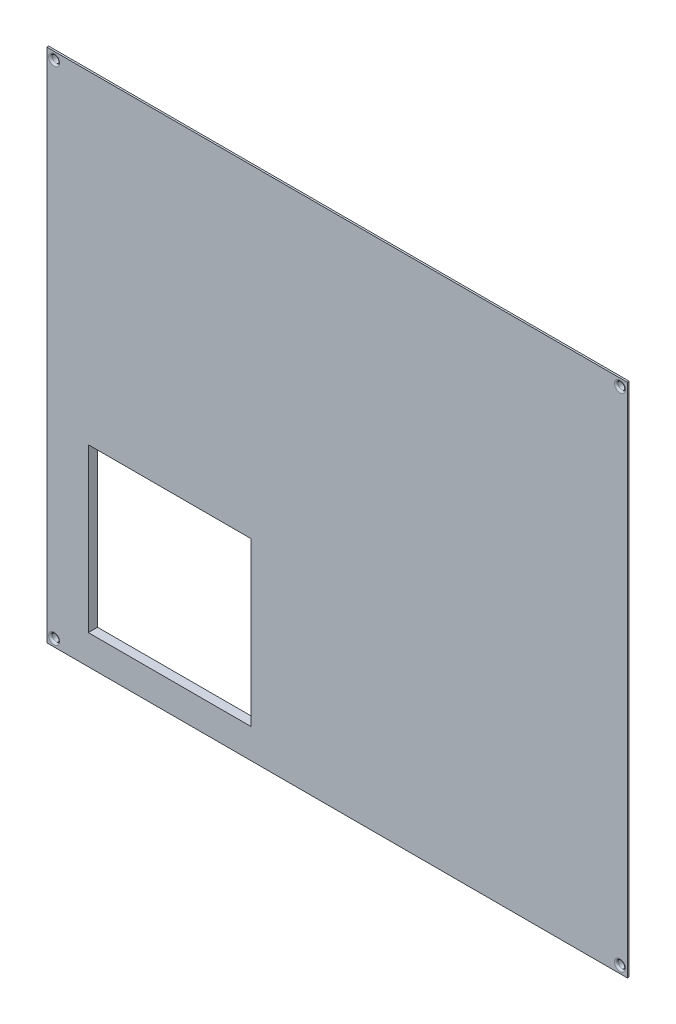
ISO-10303-21;
HEADER;
FILE_DESCRIPTION(('STEP AP214'),'2;1');
FILE_NAME('part.step','',(''),(''),'','','');
FILE_SCHEMA(('AUTOMOTIVE_DESIGN { 1 0 10303 214 1 1 1 1 }'));
ENDSEC;
DATA;
#1=APPLICATION_CONTEXT('core data for automotive mechanical design processes');
#2=APPLICATION_PROTOCOL_DEFINITION('international standard','automotive_design',2000,#1);
#3=PRODUCT_CONTEXT('',#1,'mechanical');
#4=PRODUCT('Part','Part','',(#3));
#5=PRODUCT_RELATED_PRODUCT_CATEGORY('part','',(#4));
#6=PRODUCT_DEFINITION_FORMATION('','',#4);
#7=PRODUCT_DEFINITION_CONTEXT('part definition',#1,'design');
#8=PRODUCT_DEFINITION('design','',#6,#7);
#9=PRODUCT_DEFINITION_SHAPE('','',#8);
#10=(LENGTH_UNIT() NAMED_UNIT(*) SI_UNIT(.MILLI.,.METRE.));
#11=(NAMED_UNIT(*) PLANE_ANGLE_UNIT() SI_UNIT($,.RADIAN.));
#12=(NAMED_UNIT(*) SI_UNIT($,.STERADIAN.) SOLID_ANGLE_UNIT());
#13=UNCERTAINTY_MEASURE_WITH_UNIT(LENGTH_MEASURE(1.E-05),#10,'distance_accuracy_value','');
#14=(GEOMETRIC_REPRESENTATION_CONTEXT(3) GLOBAL_UNCERTAINTY_ASSIGNED_CONTEXT((#13)) GLOBAL_UNIT_ASSIGNED_CONTEXT((#10,
#11,#12)) REPRESENTATION_CONTEXT('',''));
#15=CARTESIAN_POINT('',(0.,0.,0.));
#16=DIRECTION('',(0.,0.,1.));
#17=DIRECTION('',(1.,0.,0.));
#18=AXIS2_PLACEMENT_3D('',#15,#16,#17);
#19=CARTESIAN_POINT('',(0.,0.,2.5));
#20=DIRECTION('',(1.,0.,0.));
#21=DIRECTION('',(0.,1.,0.));
#22=AXIS2_PLACEMENT_3D('',#19,#20,#21);
#23=PLANE('',#22);
#24=DIRECTION('',(0.,0.,-1.));
#25=VECTOR('',#24,1.);
#26=CARTESIAN_POINT('',(0.,139.5,2.5));
#27=LINE('',#26,#25);
#28=CARTESIAN_POINT('',(0.,139.5,2.5));
#29=VERTEX_POINT('',#28);
#30=CARTESIAN_POINT('',(0.,139.5,1.99999999999997));
#31=VERTEX_POINT('',#30);
#32=EDGE_CURVE('E286',#29,#31,#27,.T.);
#33=ORIENTED_EDGE('',*,*,#32,.T.);
#34=DIRECTION('',(0.,-1.,0.));
#35=VECTOR('',#34,1.);
#36=CARTESIAN_POINT('',(0.,0.,1.99999999999997));
#37=LINE('',#36,#35);
#38=CARTESIAN_POINT('',(0.,0.,1.99999999999997));
#39=VERTEX_POINT('',#38);
#40=EDGE_CURVE('E144',#31,#39,#37,.T.);
#41=ORIENTED_EDGE('',*,*,#40,.T.);
#42=DIRECTION('',(0.,0.,-1.));
#43=VECTOR('',#42,1.);
#44=CARTESIAN_POINT('',(0.,0.,2.5));
#45=LINE('',#44,#43);
#46=CARTESIAN_POINT('',(0.,0.,2.5));
#47=VERTEX_POINT('',#46);
#48=EDGE_CURVE('E284',#47,#39,#45,.T.);
#49=ORIENTED_EDGE('',*,*,#48,.F.);
#50=DIRECTION('',(0.,-1.,0.));
#51=VECTOR('',#50,1.);
#52=CARTESIAN_POINT('',(0.,0.,2.5));
#53=LINE('',#52,#51);
#54=EDGE_CURVE('E170',#29,#47,#53,.T.);
#55=ORIENTED_EDGE('',*,*,#54,.F.);
#56=EDGE_LOOP('',(#33,#41,#49,#55));
#57=FACE_BOUND('',#56,.T.);
#58=ADVANCED_FACE('F33',(#57),#23,.F.);
#59=CARTESIAN_POINT('',(0.,0.,2.5));
#60=DIRECTION('',(0.,1.,0.));
#61=DIRECTION('',(0.,0.,1.));
#62=AXIS2_PLACEMENT_3D('',#59,#60,#61);
#63=PLANE('',#62);
#64=ORIENTED_EDGE('',*,*,#48,.T.);
#65=DIRECTION('',(1.,0.,0.));
#66=VECTOR('',#65,1.);
#67=CARTESIAN_POINT('',(157.,0.,1.99999999999997));
#68=LINE('',#67,#66);
#69=CARTESIAN_POINT('',(157.,0.,1.99999999999997));
#70=VERTEX_POINT('',#69);
#71=EDGE_CURVE('E159',#39,#70,#68,.T.);
#72=ORIENTED_EDGE('',*,*,#71,.T.);
#73=DIRECTION('',(0.,0.,-1.));
#74=VECTOR('',#73,1.);
#75=CARTESIAN_POINT('',(157.,0.,2.5));
#76=LINE('',#75,#74);
#77=CARTESIAN_POINT('',(157.,0.,2.5));
#78=VERTEX_POINT('',#77);
#79=EDGE_CURVE('E292',#78,#70,#76,.T.);
#80=ORIENTED_EDGE('',*,*,#79,.F.);
#81=DIRECTION('',(1.,0.,0.));
#82=VECTOR('',#81,1.);
#83=CARTESIAN_POINT('',(0.,0.,2.5));
#84=LINE('',#83,#82);
#85=EDGE_CURVE('E290',#47,#78,#84,.T.);
#86=ORIENTED_EDGE('',*,*,#85,.F.);
#87=EDGE_LOOP('',(#64,#72,#80,#86));
#88=FACE_BOUND('',#87,.T.);
#89=ADVANCED_FACE('F213',(#88),#63,.F.);
#90=CARTESIAN_POINT('',(157.,0.,2.5));
#91=DIRECTION('',(-1.,0.,0.));
#92=DIRECTION('',(0.,-1.,0.));
#93=AXIS2_PLACEMENT_3D('',#90,#91,#92);
#94=PLANE('',#93);
#95=ORIENTED_EDGE('',*,*,#79,.T.);
#96=DIRECTION('',(0.,1.,0.));
#97=VECTOR('',#96,1.);
#98=CARTESIAN_POINT('',(157.,139.5,1.99999999999997));
#99=LINE('',#98,#97);
#100=CARTESIAN_POINT('',(157.,139.5,1.99999999999997));
#101=VERTEX_POINT('',#100);
#102=EDGE_CURVE('E273',#70,#101,#99,.T.);
#103=ORIENTED_EDGE('',*,*,#102,.T.);
#104=DIRECTION('',(0.,0.,-1.));
#105=VECTOR('',#104,1.);
#106=CARTESIAN_POINT('',(157.,139.5,2.5));
#107=LINE('',#106,#105);
#108=CARTESIAN_POINT('',(157.,139.5,2.5));
#109=VERTEX_POINT('',#108);
#110=EDGE_CURVE('E295',#109,#101,#107,.T.);
#111=ORIENTED_EDGE('',*,*,#110,.F.);
#112=DIRECTION('',(0.,1.,0.));
#113=VECTOR('',#112,1.);
#114=CARTESIAN_POINT('',(157.,0.,2.5));
#115=LINE('',#114,#113);
#116=EDGE_CURVE('E339',#78,#109,#115,.T.);
#117=ORIENTED_EDGE('',*,*,#116,.F.);
#118=EDGE_LOOP('',(#95,#103,#111,#117));
#119=FACE_BOUND('',#118,.T.);
#120=ADVANCED_FACE('F219',(#119),#94,.F.);
#121=CARTESIAN_POINT('',(0.,139.5,2.5));
#122=DIRECTION('',(0.,-1.,0.));
#123=DIRECTION('',(0.,0.,-1.));
#124=AXIS2_PLACEMENT_3D('',#121,#122,#123);
#125=PLANE('',#124);
#126=ORIENTED_EDGE('',*,*,#110,.T.);
#127=DIRECTION('',(-1.,0.,0.));
#128=VECTOR('',#127,1.);
#129=CARTESIAN_POINT('',(0.,139.5,1.99999999999997));
#130=LINE('',#129,#128);
#131=EDGE_CURVE('E280',#101,#31,#130,.T.);
#132=ORIENTED_EDGE('',*,*,#131,.T.);
#133=ORIENTED_EDGE('',*,*,#32,.F.);
#134=DIRECTION('',(-1.,0.,0.));
#135=VECTOR('',#134,1.);
#136=CARTESIAN_POINT('',(0.,139.5,2.5));
#137=LINE('',#136,#135);
#138=EDGE_CURVE('E341',#109,#29,#137,.T.);
#139=ORIENTED_EDGE('',*,*,#138,.F.);
#140=EDGE_LOOP('',(#126,#132,#133,#139));
#141=FACE_BOUND('',#140,.T.);
#142=ADVANCED_FACE('F348',(#141),#125,.F.);
#143=CARTESIAN_POINT('',(0.,0.,2.5));
#144=DIRECTION('',(0.,0.,-1.));
#145=DIRECTION('',(-1.,0.,0.));
#146=AXIS2_PLACEMENT_3D('',#143,#144,#145);
#147=PLANE('',#146);
#148=CARTESIAN_POINT('',(155.,2.,2.5));
#149=DIRECTION('',(0.,0.,-1.));
#150=DIRECTION('',(-1.,0.,0.));
#151=AXIS2_PLACEMENT_3D('',#148,#149,#150);
#152=CIRCLE('',#151,1.5);
#153=CARTESIAN_POINT('',(153.5,2.,2.5));
#154=VERTEX_POINT('',#153);
#155=EDGE_CURVE('E189',#154,#154,#152,.T.);
#156=ORIENTED_EDGE('',*,*,#155,.T.);
#157=EDGE_LOOP('',(#156));
#158=FACE_BOUND('',#157,.T.);
#159=CARTESIAN_POINT('',(1.99999999999997,2.,2.5));
#160=DIRECTION('',(0.,0.,-1.));
#161=DIRECTION('',(-1.,0.,0.));
#162=AXIS2_PLACEMENT_3D('',#159,#160,#161);
#163=CIRCLE('',#162,1.5);
#164=CARTESIAN_POINT('',(0.499999999999974,2.,2.5));
#165=VERTEX_POINT('',#164);
#166=EDGE_CURVE('E186',#165,#165,#163,.T.);
#167=ORIENTED_EDGE('',*,*,#166,.T.);
#168=EDGE_LOOP('',(#167));
#169=FACE_BOUND('',#168,.T.);
#170=CARTESIAN_POINT('',(1.99999999999997,137.5,2.5));
#171=DIRECTION('',(0.,0.,-1.));
#172=DIRECTION('',(-1.,0.,0.));
#173=AXIS2_PLACEMENT_3D('',#170,#171,#172);
#174=CIRCLE('',#173,1.5);
#175=CARTESIAN_POINT('',(0.499999999999974,137.5,2.5));
#176=VERTEX_POINT('',#175);
#177=EDGE_CURVE('E183',#176,#176,#174,.T.);
#178=ORIENTED_EDGE('',*,*,#177,.T.);
#179=EDGE_LOOP('',(#178));
#180=FACE_BOUND('',#179,.T.);
#181=CARTESIAN_POINT('',(155.,137.5,2.5));
#182=DIRECTION('',(0.,0.,-1.));
#183=DIRECTION('',(-1.,0.,0.));
#184=AXIS2_PLACEMENT_3D('',#181,#182,#183);
#185=CIRCLE('',#184,1.5);
#186=CARTESIAN_POINT('',(153.5,137.5,2.5));
#187=VERTEX_POINT('',#186);
#188=EDGE_CURVE('E180',#187,#187,#185,.T.);
#189=ORIENTED_EDGE('',*,*,#188,.T.);
#190=EDGE_LOOP('',(#189));
#191=FACE_BOUND('',#190,.T.);
#192=DIRECTION('',(-1.,0.,0.));
#193=VECTOR('',#192,1.);
#194=CARTESIAN_POINT('',(0.,7.99999999999998,2.5));
#195=LINE('',#194,#193);
#196=CARTESIAN_POINT('',(55.2239720785397,7.99999999999999,2.5));
#197=VERTEX_POINT('',#196);
#198=CARTESIAN_POINT('',(11.2239720785396,7.99999999999999,2.5));
#199=VERTEX_POINT('',#198);
#200=EDGE_CURVE('E332',#197,#199,#195,.T.);
#201=ORIENTED_EDGE('',*,*,#200,.T.);
#202=DIRECTION('',(0.,1.,0.));
#203=VECTOR('',#202,1.);
#204=CARTESIAN_POINT('',(11.2239720785396,0.,2.5));
#205=LINE('',#204,#203);
#206=CARTESIAN_POINT('',(11.2239720785397,52.,2.5));
#207=VERTEX_POINT('',#206);
#208=EDGE_CURVE('E165',#199,#207,#205,.T.);
#209=ORIENTED_EDGE('',*,*,#208,.T.);
#210=DIRECTION('',(1.,0.,0.));
#211=VECTOR('',#210,1.);
#212=CARTESIAN_POINT('',(0.,52.,2.5));
#213=LINE('',#212,#211);
#214=CARTESIAN_POINT('',(55.2239720785397,52.,2.5));
#215=VERTEX_POINT('',#214);
#216=EDGE_CURVE('E320',#207,#215,#213,.T.);
#217=ORIENTED_EDGE('',*,*,#216,.T.);
#218=DIRECTION('',(0.,-1.,0.));
#219=VECTOR('',#218,1.);
#220=CARTESIAN_POINT('',(55.2239720785397,0.,2.5));
#221=LINE('',#220,#219);
#222=EDGE_CURVE('E329',#215,#197,#221,.T.);
#223=ORIENTED_EDGE('',*,*,#222,.T.);
#224=EDGE_LOOP('',(#201,#209,#217,#223));
#225=FACE_BOUND('',#224,.T.);
#226=ORIENTED_EDGE('',*,*,#54,.T.);
#227=ORIENTED_EDGE('',*,*,#85,.T.);
#228=ORIENTED_EDGE('',*,*,#116,.T.);
#229=ORIENTED_EDGE('',*,*,#138,.T.);
#230=EDGE_LOOP('',(#226,#227,#228,#229));
#231=FACE_BOUND('',#230,.T.);
#232=ADVANCED_FACE('F354',(#158,#169,#180,#191,#225,#231),#147,.F.);
#233=CARTESIAN_POINT('',(0.,0.,0.));
#234=DIRECTION('',(0.,0.,-1.));
#235=DIRECTION('',(-1.,0.,0.));
#236=AXIS2_PLACEMENT_3D('',#233,#234,#235);
#237=PLANE('',#236);
#238=CARTESIAN_POINT('',(155.,2.,0.));
#239=DIRECTION('',(0.,0.,-1.));
#240=DIRECTION('',(-1.,0.,0.));
#241=AXIS2_PLACEMENT_3D('',#238,#239,#240);
#242=CIRCLE('',#241,0.999999999999998);
#243=CARTESIAN_POINT('',(154.,1.99999999999997,0.));
#244=VERTEX_POINT('',#243);
#245=CARTESIAN_POINT('',(155.,3.,0.));
#246=VERTEX_POINT('',#245);
#247=EDGE_CURVE('E255',#244,#246,#242,.T.);
#248=ORIENTED_EDGE('',*,*,#247,.F.);
#249=DIRECTION('',(-1.,0.,0.));
#250=VECTOR('',#249,1.);
#251=CARTESIAN_POINT('',(0.,1.99999999999997,0.));
#252=LINE('',#251,#250);
#253=CARTESIAN_POINT('',(2.99999999999997,1.99999999999997,0.));
#254=VERTEX_POINT('',#253);
#255=EDGE_CURVE('E270',#244,#254,#252,.T.);
#256=ORIENTED_EDGE('',*,*,#255,.T.);
#257=CARTESIAN_POINT('',(1.99999999999997,2.,0.));
#258=DIRECTION('',(0.,0.,-1.));
#259=DIRECTION('',(-1.,0.,0.));
#260=AXIS2_PLACEMENT_3D('',#257,#258,#259);
#261=CIRCLE('',#260,0.999999999999998);
#262=CARTESIAN_POINT('',(1.99999999999997,3.00000000000003,0.));
#263=VERTEX_POINT('',#262);
#264=EDGE_CURVE('E138',#263,#254,#261,.T.);
#265=ORIENTED_EDGE('',*,*,#264,.F.);
#266=DIRECTION('',(0.,1.,0.));
#267=VECTOR('',#266,1.);
#268=CARTESIAN_POINT('',(1.99999999999995,139.5,0.));
#269=LINE('',#268,#267);
#270=CARTESIAN_POINT('',(1.99999999999995,136.5,0.));
#271=VERTEX_POINT('',#270);
#272=EDGE_CURVE('E154',#263,#271,#269,.T.);
#273=ORIENTED_EDGE('',*,*,#272,.T.);
#274=CARTESIAN_POINT('',(1.99999999999997,137.5,0.));
#275=DIRECTION('',(0.,0.,-1.));
#276=DIRECTION('',(-1.,0.,0.));
#277=AXIS2_PLACEMENT_3D('',#274,#275,#276);
#278=CIRCLE('',#277,0.999999999999998);
#279=CARTESIAN_POINT('',(3.,137.5,0.));
#280=VERTEX_POINT('',#279);
#281=EDGE_CURVE('E48',#280,#271,#278,.T.);
#282=ORIENTED_EDGE('',*,*,#281,.F.);
#283=DIRECTION('',(1.,0.,0.));
#284=VECTOR('',#283,1.);
#285=CARTESIAN_POINT('',(157.,137.5,0.));
#286=LINE('',#285,#284);
#287=CARTESIAN_POINT('',(154.,137.5,0.));
#288=VERTEX_POINT('',#287);
#289=EDGE_CURVE('E271',#280,#288,#286,.T.);
#290=ORIENTED_EDGE('',*,*,#289,.T.);
#291=CARTESIAN_POINT('',(155.,137.5,0.));
#292=DIRECTION('',(0.,0.,-1.));
#293=DIRECTION('',(-1.,0.,0.));
#294=AXIS2_PLACEMENT_3D('',#291,#292,#293);
#295=CIRCLE('',#294,0.999999999999998);
#296=CARTESIAN_POINT('',(155.,136.5,0.));
#297=VERTEX_POINT('',#296);
#298=EDGE_CURVE('E269',#297,#288,#295,.T.);
#299=ORIENTED_EDGE('',*,*,#298,.F.);
#300=DIRECTION('',(0.,-1.,0.));
#301=VECTOR('',#300,1.);
#302=CARTESIAN_POINT('',(155.,0.,0.));
#303=LINE('',#302,#301);
#304=EDGE_CURVE('E263',#297,#246,#303,.T.);
#305=ORIENTED_EDGE('',*,*,#304,.T.);
#306=EDGE_LOOP('',(#248,#256,#265,#273,#282,#290,#299,#305));
#307=FACE_BOUND('',#306,.T.);
#308=DIRECTION('',(0.,1.,0.));
#309=VECTOR('',#308,1.);
#310=CARTESIAN_POINT('',(11.2239720785397,52.,0.));
#311=LINE('',#310,#309);
#312=CARTESIAN_POINT('',(11.2239720785396,7.99999999999999,0.));
#313=VERTEX_POINT('',#312);
#314=CARTESIAN_POINT('',(11.2239720785397,52.,0.));
#315=VERTEX_POINT('',#314);
#316=EDGE_CURVE('E306',#313,#315,#311,.T.);
#317=ORIENTED_EDGE('',*,*,#316,.F.);
#318=DIRECTION('',(-1.,0.,0.));
#319=VECTOR('',#318,1.);
#320=CARTESIAN_POINT('',(55.2239720785397,7.99999999999999,0.));
#321=LINE('',#320,#319);
#322=CARTESIAN_POINT('',(55.2239720785397,7.99999999999999,0.));
#323=VERTEX_POINT('',#322);
#324=EDGE_CURVE('E314',#323,#313,#321,.T.);
#325=ORIENTED_EDGE('',*,*,#324,.F.);
#326=DIRECTION('',(0.,-1.,0.));
#327=VECTOR('',#326,1.);
#328=CARTESIAN_POINT('',(55.2239720785397,52.,0.));
#329=LINE('',#328,#327);
#330=CARTESIAN_POINT('',(55.2239720785397,52.,0.));
#331=VERTEX_POINT('',#330);
#332=EDGE_CURVE('E311',#331,#323,#329,.T.);
#333=ORIENTED_EDGE('',*,*,#332,.F.);
#334=DIRECTION('',(1.,0.,0.));
#335=VECTOR('',#334,1.);
#336=CARTESIAN_POINT('',(55.2239720785397,52.,0.));
#337=LINE('',#336,#335);
#338=EDGE_CURVE('E308',#315,#331,#337,.T.);
#339=ORIENTED_EDGE('',*,*,#338,.F.);
#340=EDGE_LOOP('',(#317,#325,#333,#339));
#341=FACE_BOUND('',#340,.T.);
#342=ADVANCED_FACE('F237',(#307,#341),#237,.T.);
#343=CARTESIAN_POINT('',(0.,139.5,1.99999999999997));
#344=DIRECTION('',(0.,0.707106781186547,-0.707106781186547));
#345=DIRECTION('',(1.,0.,0.));
#346=AXIS2_PLACEMENT_3D('',#343,#344,#345);
#347=PLANE('',#346);
#348=CARTESIAN_POINT('',(155.,137.5,0.));
#349=DIRECTION('',(0.,0.707106781186547,-0.707106781186547));
#350=DIRECTION('',(0.,0.707106781186548,0.707106781186548));
#351=AXIS2_PLACEMENT_3D('',#348,#349,#350);
#352=ELLIPSE('',#351,1.41421356237309,0.999999999999998);
#353=CARTESIAN_POINT('',(155.707106781187,138.207106781187,0.707106781186524));
#354=VERTEX_POINT('',#353);
#355=EDGE_CURVE('E56',#288,#354,#352,.T.);
#356=ORIENTED_EDGE('',*,*,#355,.F.);
#357=ORIENTED_EDGE('',*,*,#289,.F.);
#358=CARTESIAN_POINT('',(1.99999999999997,137.5,0.));
#359=DIRECTION('',(0.,0.707106781186547,-0.707106781186547));
#360=DIRECTION('',(0.,0.707106781186548,0.707106781186548));
#361=AXIS2_PLACEMENT_3D('',#358,#359,#360);
#362=ELLIPSE('',#361,1.41421356237309,0.999999999999998);
#363=CARTESIAN_POINT('',(1.29289321881343,138.207106781187,0.707106781186524));
#364=VERTEX_POINT('',#363);
#365=EDGE_CURVE('E303',#364,#280,#362,.T.);
#366=ORIENTED_EDGE('',*,*,#365,.F.);
#367=DIRECTION('',(0.577350269189626,-0.577350269189626,-0.577350269189626));
#368=VECTOR('',#367,1.);
#369=CARTESIAN_POINT('',(46.5,93.,-44.5));
#370=LINE('',#369,#368);
#371=EDGE_CURVE('E163',#31,#364,#370,.T.);
#372=ORIENTED_EDGE('',*,*,#371,.F.);
#373=ORIENTED_EDGE('',*,*,#131,.F.);
#374=DIRECTION('',(-0.577350269189626,-0.577350269189626,-0.577350269189626));
#375=VECTOR('',#374,1.);
#376=CARTESIAN_POINT('',(104.666666666667,87.1666666666667,-50.3333333333334));
#377=LINE('',#376,#375);
#378=EDGE_CURVE('E160',#354,#101,#377,.F.);
#379=ORIENTED_EDGE('',*,*,#378,.F.);
#380=EDGE_LOOP('',(#356,#357,#366,#372,#373,#379));
#381=FACE_BOUND('',#380,.T.);
#382=ADVANCED_FACE('F234',(#381),#347,.T.);
#383=CARTESIAN_POINT('',(0.,0.,1.99999999999997));
#384=DIRECTION('',(-0.707106781186547,0.,-0.707106781186547));
#385=DIRECTION('',(0.,1.,0.));
#386=AXIS2_PLACEMENT_3D('',#383,#384,#385);
#387=PLANE('',#386);
#388=CARTESIAN_POINT('',(1.99999999999997,137.5,0.));
#389=DIRECTION('',(-0.707106781186547,0.,-0.707106781186547));
#390=DIRECTION('',(-0.707106781186548,0.,0.707106781186548));
#391=AXIS2_PLACEMENT_3D('',#388,#389,#390);
#392=ELLIPSE('',#391,1.41421356237309,0.999999999999998);
#393=EDGE_CURVE('E175',#271,#364,#392,.T.);
#394=ORIENTED_EDGE('',*,*,#393,.F.);
#395=ORIENTED_EDGE('',*,*,#272,.F.);
#396=CARTESIAN_POINT('',(1.99999999999997,2.,0.));
#397=DIRECTION('',(-0.707106781186547,0.,-0.707106781186547));
#398=DIRECTION('',(-0.707106781186548,0.,0.707106781186548));
#399=AXIS2_PLACEMENT_3D('',#396,#397,#398);
#400=ELLIPSE('',#399,1.41421356237309,0.999999999999998);
#401=CARTESIAN_POINT('',(1.29289321881344,1.29289321881344,0.707106781186534));
#402=VERTEX_POINT('',#401);
#403=EDGE_CURVE('E136',#402,#263,#400,.T.);
#404=ORIENTED_EDGE('',*,*,#403,.F.);
#405=DIRECTION('',(-0.577350269189626,-0.577350269189626,0.577350269189626));
#406=VECTOR('',#405,1.);
#407=CARTESIAN_POINT('',(0.,0.,1.99999999999997));
#408=LINE('',#407,#406);
#409=EDGE_CURVE('E151',#39,#402,#408,.F.);
#410=ORIENTED_EDGE('',*,*,#409,.F.);
#411=ORIENTED_EDGE('',*,*,#40,.F.);
#412=ORIENTED_EDGE('',*,*,#371,.T.);
#413=EDGE_LOOP('',(#394,#395,#404,#410,#411,#412));
#414=FACE_BOUND('',#413,.T.);
#415=ADVANCED_FACE('F149',(#414),#387,.T.);
#416=CARTESIAN_POINT('',(157.,0.,1.99999999999997));
#417=DIRECTION('',(0.707106781186547,0.,-0.707106781186547));
#418=DIRECTION('',(0.,-1.,0.));
#419=AXIS2_PLACEMENT_3D('',#416,#417,#418);
#420=PLANE('',#419);
#421=CARTESIAN_POINT('',(155.,2.,0.));
#422=DIRECTION('',(0.707106781186547,0.,-0.707106781186547));
#423=DIRECTION('',(0.707106781186548,0.,0.707106781186548));
#424=AXIS2_PLACEMENT_3D('',#421,#422,#423);
#425=ELLIPSE('',#424,1.41421356237309,0.999999999999998);
#426=CARTESIAN_POINT('',(155.707106781187,1.29289321881345,0.70710678118652));
#427=VERTEX_POINT('',#426);
#428=EDGE_CURVE('E257',#246,#427,#425,.T.);
#429=ORIENTED_EDGE('',*,*,#428,.F.);
#430=ORIENTED_EDGE('',*,*,#304,.F.);
#431=CARTESIAN_POINT('',(155.,137.5,0.));
#432=DIRECTION('',(0.707106781186547,0.,-0.707106781186547));
#433=DIRECTION('',(0.707106781186548,0.,0.707106781186548));
#434=AXIS2_PLACEMENT_3D('',#431,#432,#433);
#435=ELLIPSE('',#434,1.41421356237309,0.999999999999998);
#436=EDGE_CURVE('E173',#354,#297,#435,.T.);
#437=ORIENTED_EDGE('',*,*,#436,.F.);
#438=ORIENTED_EDGE('',*,*,#378,.T.);
#439=ORIENTED_EDGE('',*,*,#102,.F.);
#440=DIRECTION('',(-0.577350269189626,0.577350269189626,-0.577350269189626));
#441=VECTOR('',#440,1.);
#442=CARTESIAN_POINT('',(157.,0.,1.99999999999997));
#443=LINE('',#442,#441);
#444=EDGE_CURVE('E161',#427,#70,#443,.F.);
#445=ORIENTED_EDGE('',*,*,#444,.F.);
#446=EDGE_LOOP('',(#429,#430,#437,#438,#439,#445));
#447=FACE_BOUND('',#446,.T.);
#448=ADVANCED_FACE('F228',(#447),#420,.T.);
#449=CARTESIAN_POINT('',(0.,0.,1.99999999999997));
#450=DIRECTION('',(0.,-0.707106781186547,-0.707106781186547));
#451=DIRECTION('',(-1.,0.,0.));
#452=AXIS2_PLACEMENT_3D('',#449,#450,#451);
#453=PLANE('',#452);
#454=CARTESIAN_POINT('',(155.,2.,0.));
#455=DIRECTION('',(0.,-0.707106781186547,-0.707106781186547));
#456=DIRECTION('',(0.,-0.707106781186548,0.707106781186548));
#457=AXIS2_PLACEMENT_3D('',#454,#455,#456);
#458=ELLIPSE('',#457,1.41421356237309,0.999999999999998);
#459=EDGE_CURVE('E143',#427,#244,#458,.T.);
#460=ORIENTED_EDGE('',*,*,#459,.F.);
#461=ORIENTED_EDGE('',*,*,#444,.T.);
#462=ORIENTED_EDGE('',*,*,#71,.F.);
#463=ORIENTED_EDGE('',*,*,#409,.T.);
#464=CARTESIAN_POINT('',(1.99999999999997,2.,0.));
#465=DIRECTION('',(0.,-0.707106781186547,-0.707106781186547));
#466=DIRECTION('',(0.,-0.707106781186548,0.707106781186548));
#467=AXIS2_PLACEMENT_3D('',#464,#465,#466);
#468=ELLIPSE('',#467,1.41421356237309,0.999999999999998);
#469=EDGE_CURVE('E133',#254,#402,#468,.T.);
#470=ORIENTED_EDGE('',*,*,#469,.F.);
#471=ORIENTED_EDGE('',*,*,#255,.F.);
#472=EDGE_LOOP('',(#460,#461,#462,#463,#470,#471));
#473=FACE_BOUND('',#472,.T.);
#474=ADVANCED_FACE('F157',(#473),#453,.T.);
#475=CARTESIAN_POINT('',(11.2239720785397,52.,10.));
#476=DIRECTION('',(-1.,0.,0.));
#477=DIRECTION('',(0.,-1.,0.));
#478=AXIS2_PLACEMENT_3D('',#475,#476,#477);
#479=PLANE('',#478);
#480=DIRECTION('',(0.,0.,-1.));
#481=VECTOR('',#480,1.);
#482=CARTESIAN_POINT('',(11.2239720785396,7.99999999999999,10.));
#483=LINE('',#482,#481);
#484=EDGE_CURVE('E318',#199,#313,#483,.T.);
#485=ORIENTED_EDGE('',*,*,#484,.T.);
#486=ORIENTED_EDGE('',*,*,#316,.T.);
#487=DIRECTION('',(0.,0.,-1.));
#488=VECTOR('',#487,1.);
#489=CARTESIAN_POINT('',(11.2239720785397,52.,10.));
#490=LINE('',#489,#488);
#491=EDGE_CURVE('E317',#207,#315,#490,.T.);
#492=ORIENTED_EDGE('',*,*,#491,.F.);
#493=ORIENTED_EDGE('',*,*,#208,.F.);
#494=EDGE_LOOP('',(#485,#486,#492,#493));
#495=FACE_BOUND('',#494,.T.);
#496=ADVANCED_FACE('F227',(#495),#479,.F.);
#497=CARTESIAN_POINT('',(55.2239720785397,7.99999999999999,10.));
#498=DIRECTION('',(0.,-1.,0.));
#499=DIRECTION('',(1.,0.,0.));
#500=AXIS2_PLACEMENT_3D('',#497,#498,#499);
#501=PLANE('',#500);
#502=DIRECTION('',(0.,0.,-1.));
#503=VECTOR('',#502,1.);
#504=CARTESIAN_POINT('',(55.2239720785397,7.99999999999999,10.));
#505=LINE('',#504,#503);
#506=EDGE_CURVE('E321',#197,#323,#505,.T.);
#507=ORIENTED_EDGE('',*,*,#506,.T.);
#508=ORIENTED_EDGE('',*,*,#324,.T.);
#509=ORIENTED_EDGE('',*,*,#484,.F.);
#510=ORIENTED_EDGE('',*,*,#200,.F.);
#511=EDGE_LOOP('',(#507,#508,#509,#510));
#512=FACE_BOUND('',#511,.T.);
#513=ADVANCED_FACE('F419',(#512),#501,.F.);
#514=CARTESIAN_POINT('',(55.2239720785397,52.,10.));
#515=DIRECTION('',(1.,0.,0.));
#516=DIRECTION('',(0.,1.,0.));
#517=AXIS2_PLACEMENT_3D('',#514,#515,#516);
#518=PLANE('',#517);
#519=DIRECTION('',(0.,0.,-1.));
#520=VECTOR('',#519,1.);
#521=CARTESIAN_POINT('',(55.2239720785397,52.,10.));
#522=LINE('',#521,#520);
#523=EDGE_CURVE('E323',#215,#331,#522,.T.);
#524=ORIENTED_EDGE('',*,*,#523,.T.);
#525=ORIENTED_EDGE('',*,*,#332,.T.);
#526=ORIENTED_EDGE('',*,*,#506,.F.);
#527=ORIENTED_EDGE('',*,*,#222,.F.);
#528=EDGE_LOOP('',(#524,#525,#526,#527));
#529=FACE_BOUND('',#528,.T.);
#530=ADVANCED_FACE('F425',(#529),#518,.F.);
#531=CARTESIAN_POINT('',(55.2239720785397,52.,10.));
#532=DIRECTION('',(0.,1.,0.));
#533=DIRECTION('',(0.,0.,1.));
#534=AXIS2_PLACEMENT_3D('',#531,#532,#533);
#535=PLANE('',#534);
#536=ORIENTED_EDGE('',*,*,#491,.T.);
#537=ORIENTED_EDGE('',*,*,#338,.T.);
#538=ORIENTED_EDGE('',*,*,#523,.F.);
#539=ORIENTED_EDGE('',*,*,#216,.F.);
#540=EDGE_LOOP('',(#536,#537,#538,#539));
#541=FACE_BOUND('',#540,.T.);
#542=ADVANCED_FACE('F433',(#541),#535,.F.);
#543=CARTESIAN_POINT('',(1.99999999999997,2.,-7.5));
#544=DIRECTION('',(0.,0.,1.));
#545=DIRECTION('',(1.,0.,0.));
#546=AXIS2_PLACEMENT_3D('',#543,#544,#545);
#547=CYLINDRICAL_SURFACE('',#546,0.999999999999998);
#548=CARTESIAN_POINT('',(1.99999999999997,2.,2.));
#549=DIRECTION('',(0.,0.,-1.));
#550=DIRECTION('',(-1.,0.,0.));
#551=AXIS2_PLACEMENT_3D('',#548,#549,#550);
#552=CIRCLE('',#551,0.999999999999998);
#553=CARTESIAN_POINT('',(0.999999999999974,2.,2.));
#554=VERTEX_POINT('',#553);
#555=EDGE_CURVE('E192',#554,#554,#552,.F.);
#556=ORIENTED_EDGE('',*,*,#555,.T.);
#557=EDGE_LOOP('',(#556));
#558=FACE_BOUND('',#557,.T.);
#559=ORIENTED_EDGE('',*,*,#264,.T.);
#560=ORIENTED_EDGE('',*,*,#469,.T.);
#561=ORIENTED_EDGE('',*,*,#403,.T.);
#562=EDGE_LOOP('',(#559,#560,#561));
#563=FACE_BOUND('',#562,.T.);
#564=ADVANCED_FACE('F135',(#558,#563),#547,.F.);
#565=CARTESIAN_POINT('',(155.,2.,-7.5));
#566=DIRECTION('',(0.,0.,1.));
#567=DIRECTION('',(1.,0.,0.));
#568=AXIS2_PLACEMENT_3D('',#565,#566,#567);
#569=CYLINDRICAL_SURFACE('',#568,0.999999999999998);
#570=CARTESIAN_POINT('',(155.,2.,2.));
#571=DIRECTION('',(0.,0.,-1.));
#572=DIRECTION('',(-1.,0.,0.));
#573=AXIS2_PLACEMENT_3D('',#570,#571,#572);
#574=CIRCLE('',#573,0.999999999999998);
#575=CARTESIAN_POINT('',(154.,2.,2.));
#576=VERTEX_POINT('',#575);
#577=EDGE_CURVE('E177',#576,#576,#574,.F.);
#578=ORIENTED_EDGE('',*,*,#577,.T.);
#579=EDGE_LOOP('',(#578));
#580=FACE_BOUND('',#579,.T.);
#581=ORIENTED_EDGE('',*,*,#247,.T.);
#582=ORIENTED_EDGE('',*,*,#428,.T.);
#583=ORIENTED_EDGE('',*,*,#459,.T.);
#584=EDGE_LOOP('',(#581,#582,#583));
#585=FACE_BOUND('',#584,.T.);
#586=ADVANCED_FACE('F250',(#580,#585),#569,.F.);
#587=CARTESIAN_POINT('',(155.,137.5,-7.5));
#588=DIRECTION('',(0.,0.,1.));
#589=DIRECTION('',(1.,0.,0.));
#590=AXIS2_PLACEMENT_3D('',#587,#588,#589);
#591=CYLINDRICAL_SURFACE('',#590,0.999999999999998);
#592=CARTESIAN_POINT('',(155.,137.5,2.));
#593=DIRECTION('',(0.,0.,-1.));
#594=DIRECTION('',(-1.,0.,0.));
#595=AXIS2_PLACEMENT_3D('',#592,#593,#594);
#596=CIRCLE('',#595,0.999999999999998);
#597=CARTESIAN_POINT('',(154.,137.5,2.));
#598=VERTEX_POINT('',#597);
#599=EDGE_CURVE('E11',#598,#598,#596,.F.);
#600=ORIENTED_EDGE('',*,*,#599,.T.);
#601=EDGE_LOOP('',(#600));
#602=FACE_BOUND('',#601,.T.);
#603=ORIENTED_EDGE('',*,*,#298,.T.);
#604=ORIENTED_EDGE('',*,*,#355,.T.);
#605=ORIENTED_EDGE('',*,*,#436,.T.);
#606=EDGE_LOOP('',(#603,#604,#605));
#607=FACE_BOUND('',#606,.T.);
#608=ADVANCED_FACE('F244',(#602,#607),#591,.F.);
#609=CARTESIAN_POINT('',(1.99999999999997,137.5,-7.5));
#610=DIRECTION('',(0.,0.,1.));
#611=DIRECTION('',(1.,0.,0.));
#612=AXIS2_PLACEMENT_3D('',#609,#610,#611);
#613=CYLINDRICAL_SURFACE('',#612,0.999999999999998);
#614=CARTESIAN_POINT('',(1.99999999999997,137.5,2.));
#615=DIRECTION('',(0.,0.,-1.));
#616=DIRECTION('',(-1.,0.,0.));
#617=AXIS2_PLACEMENT_3D('',#614,#615,#616);
#618=CIRCLE('',#617,0.999999999999998);
#619=CARTESIAN_POINT('',(0.999999999999974,137.5,2.));
#620=VERTEX_POINT('',#619);
#621=EDGE_CURVE('E41',#620,#620,#618,.F.);
#622=ORIENTED_EDGE('',*,*,#621,.T.);
#623=EDGE_LOOP('',(#622));
#624=FACE_BOUND('',#623,.T.);
#625=ORIENTED_EDGE('',*,*,#281,.T.);
#626=ORIENTED_EDGE('',*,*,#393,.T.);
#627=ORIENTED_EDGE('',*,*,#365,.T.);
#628=EDGE_LOOP('',(#625,#626,#627));
#629=FACE_BOUND('',#628,.T.);
#630=ADVANCED_FACE('F197',(#624,#629),#613,.F.);
#631=CARTESIAN_POINT('',(155.,2.,2.));
#632=DIRECTION('',(0.,0.,-1.));
#633=DIRECTION('',(-1.,0.,0.));
#634=AXIS2_PLACEMENT_3D('',#631,#632,#633);
#635=TOROIDAL_SURFACE('',#634,1.5,0.5);
#636=ORIENTED_EDGE('',*,*,#155,.F.);
#637=EDGE_LOOP('',(#636));
#638=FACE_BOUND('',#637,.T.);
#639=ORIENTED_EDGE('',*,*,#577,.F.);
#640=EDGE_LOOP('',(#639));
#641=FACE_BOUND('',#640,.T.);
#642=ADVANCED_FACE('F208',(#638,#641),#635,.T.);
#643=CARTESIAN_POINT('',(1.99999999999997,2.,2.));
#644=DIRECTION('',(0.,0.,-1.));
#645=DIRECTION('',(-1.,0.,0.));
#646=AXIS2_PLACEMENT_3D('',#643,#644,#645);
#647=TOROIDAL_SURFACE('',#646,1.5,0.5);
#648=ORIENTED_EDGE('',*,*,#166,.F.);
#649=EDGE_LOOP('',(#648));
#650=FACE_BOUND('',#649,.T.);
#651=ORIENTED_EDGE('',*,*,#555,.F.);
#652=EDGE_LOOP('',(#651));
#653=FACE_BOUND('',#652,.T.);
#654=ADVANCED_FACE('F201',(#650,#653),#647,.T.);
#655=CARTESIAN_POINT('',(1.99999999999997,137.5,2.));
#656=DIRECTION('',(0.,0.,-1.));
#657=DIRECTION('',(-1.,0.,0.));
#658=AXIS2_PLACEMENT_3D('',#655,#656,#657);
#659=TOROIDAL_SURFACE('',#658,1.5,0.5);
#660=ORIENTED_EDGE('',*,*,#177,.F.);
#661=EDGE_LOOP('',(#660));
#662=FACE_BOUND('',#661,.T.);
#663=ORIENTED_EDGE('',*,*,#621,.F.);
#664=EDGE_LOOP('',(#663));
#665=FACE_BOUND('',#664,.T.);
#666=ADVANCED_FACE('F199',(#662,#665),#659,.T.);
#667=CARTESIAN_POINT('',(155.,137.5,2.));
#668=DIRECTION('',(0.,0.,-1.));
#669=DIRECTION('',(-1.,0.,0.));
#670=AXIS2_PLACEMENT_3D('',#667,#668,#669);
#671=TOROIDAL_SURFACE('',#670,1.5,0.5);
#672=ORIENTED_EDGE('',*,*,#188,.F.);
#673=EDGE_LOOP('',(#672));
#674=FACE_BOUND('',#673,.T.);
#675=ORIENTED_EDGE('',*,*,#599,.F.);
#676=EDGE_LOOP('',(#675));
#677=FACE_BOUND('',#676,.T.);
#678=ADVANCED_FACE('F35',(#674,#677),#671,.T.);
#679=CLOSED_SHELL('',(#58,#89,#120,#142,#232,#342,#382,#415,#448,#474,#496,#513,#530,#542,#564,
#586,#608,#630,#642,#654,#666,#678));
#680=MANIFOLD_SOLID_BREP('B2',#679);
#681=ADVANCED_BREP_SHAPE_REPRESENTATION('',(#18,#680),#14);
#682=SHAPE_DEFINITION_REPRESENTATION(#9,#681);
ENDSEC;
END-ISO-10303-21;
